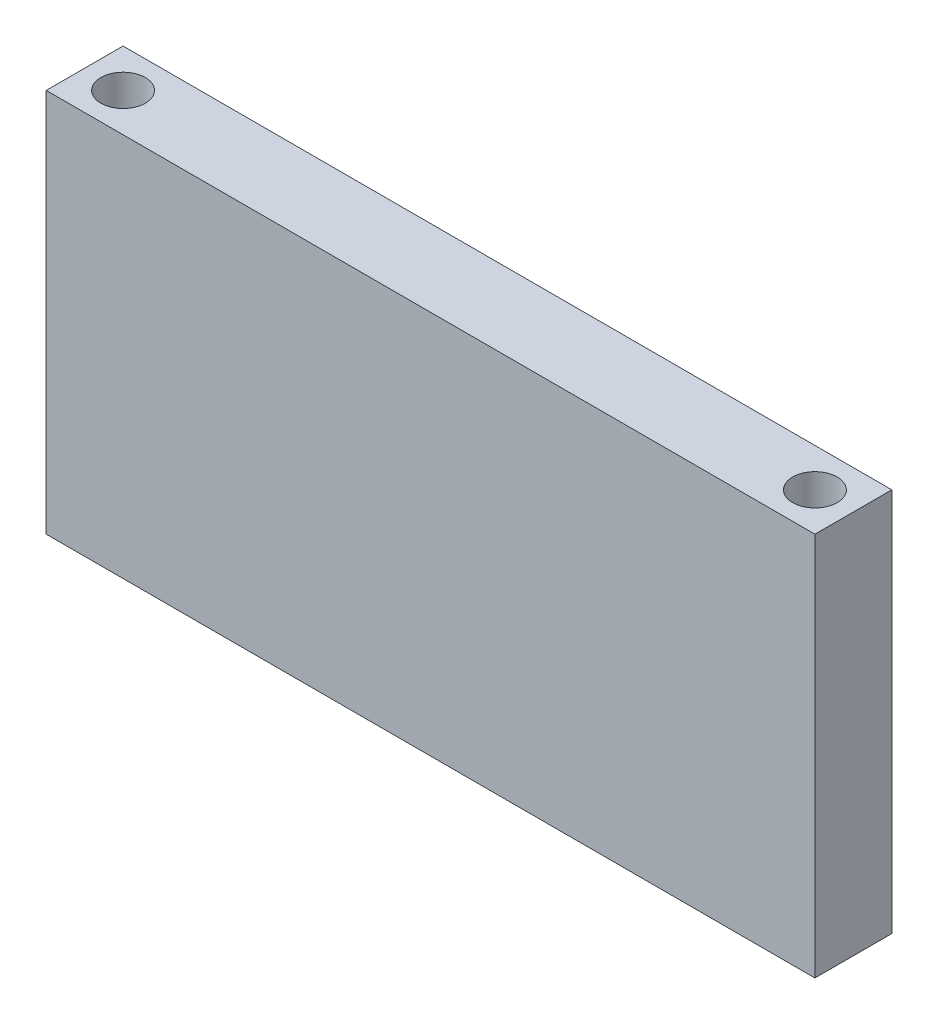
ISO-10303-21;
HEADER;
FILE_DESCRIPTION(('STEP AP214'),'2;1');
FILE_NAME('part.step','',(''),(''),'','','');
FILE_SCHEMA(('AUTOMOTIVE_DESIGN { 1 0 10303 214 1 1 1 1 }'));
ENDSEC;
DATA;
#1=APPLICATION_CONTEXT('core data for automotive mechanical design processes');
#2=APPLICATION_PROTOCOL_DEFINITION('international standard','automotive_design',2000,#1);
#3=PRODUCT_CONTEXT('',#1,'mechanical');
#4=PRODUCT('Part','Part','',(#3));
#5=PRODUCT_RELATED_PRODUCT_CATEGORY('part','',(#4));
#6=PRODUCT_DEFINITION_FORMATION('','',#4);
#7=PRODUCT_DEFINITION_CONTEXT('part definition',#1,'design');
#8=PRODUCT_DEFINITION('design','',#6,#7);
#9=PRODUCT_DEFINITION_SHAPE('','',#8);
#10=(LENGTH_UNIT() NAMED_UNIT(*) SI_UNIT(.MILLI.,.METRE.));
#11=(NAMED_UNIT(*) PLANE_ANGLE_UNIT() SI_UNIT($,.RADIAN.));
#12=(NAMED_UNIT(*) SI_UNIT($,.STERADIAN.) SOLID_ANGLE_UNIT());
#13=UNCERTAINTY_MEASURE_WITH_UNIT(LENGTH_MEASURE(1.E-05),#10,'distance_accuracy_value','');
#14=(GEOMETRIC_REPRESENTATION_CONTEXT(3) GLOBAL_UNCERTAINTY_ASSIGNED_CONTEXT((#13)) GLOBAL_UNIT_ASSIGNED_CONTEXT((#10,
#11,#12)) REPRESENTATION_CONTEXT('',''));
#15=CARTESIAN_POINT('',(0.,0.,0.));
#16=DIRECTION('',(0.,0.,1.));
#17=DIRECTION('',(1.,0.,0.));
#18=AXIS2_PLACEMENT_3D('',#15,#16,#17);
#19=CARTESIAN_POINT('',(-38.7878787878788,50.,-10.7575757575758));
#20=DIRECTION('',(1.,0.,0.));
#21=DIRECTION('',(0.,0.,-1.));
#22=AXIS2_PLACEMENT_3D('',#19,#20,#21);
#23=PLANE('',#22);
#24=DIRECTION('',(0.,0.,1.));
#25=VECTOR('',#24,1.);
#26=CARTESIAN_POINT('',(-38.7878787878788,0.,-10.7575757575758));
#27=LINE('',#26,#25);
#28=CARTESIAN_POINT('',(-38.7878787878788,0.,-10.7575757575758));
#29=VERTEX_POINT('',#28);
#30=CARTESIAN_POINT('',(-38.7878787878788,0.,-0.757575757575752));
#31=VERTEX_POINT('',#30);
#32=EDGE_CURVE('E111',#29,#31,#27,.T.);
#33=ORIENTED_EDGE('',*,*,#32,.T.);
#34=DIRECTION('',(0.,-1.,0.));
#35=VECTOR('',#34,1.);
#36=CARTESIAN_POINT('',(-38.7878787878788,50.,-0.757575757575752));
#37=LINE('',#36,#35);
#38=CARTESIAN_POINT('',(-38.7878787878788,50.,-0.757575757575752));
#39=VERTEX_POINT('',#38);
#40=EDGE_CURVE('E11',#39,#31,#37,.T.);
#41=ORIENTED_EDGE('',*,*,#40,.F.);
#42=DIRECTION('',(0.,0.,1.));
#43=VECTOR('',#42,1.);
#44=CARTESIAN_POINT('',(-38.7878787878788,50.,-10.7575757575758));
#45=LINE('',#44,#43);
#46=CARTESIAN_POINT('',(-38.7878787878788,50.,-10.7575757575758));
#47=VERTEX_POINT('',#46);
#48=EDGE_CURVE('E95',#47,#39,#45,.T.);
#49=ORIENTED_EDGE('',*,*,#48,.F.);
#50=DIRECTION('',(0.,-1.,0.));
#51=VECTOR('',#50,1.);
#52=CARTESIAN_POINT('',(-38.7878787878788,50.,-10.7575757575758));
#53=LINE('',#52,#51);
#54=EDGE_CURVE('E107',#47,#29,#53,.T.);
#55=ORIENTED_EDGE('',*,*,#54,.T.);
#56=EDGE_LOOP('',(#33,#41,#49,#55));
#57=FACE_BOUND('',#56,.T.);
#58=ADVANCED_FACE('F43',(#57),#23,.F.);
#59=CARTESIAN_POINT('',(-38.7878787878788,50.,-0.757575757575752));
#60=DIRECTION('',(0.,0.,-1.));
#61=DIRECTION('',(-1.,0.,0.));
#62=AXIS2_PLACEMENT_3D('',#59,#60,#61);
#63=PLANE('',#62);
#64=DIRECTION('',(1.,0.,0.));
#65=VECTOR('',#64,1.);
#66=CARTESIAN_POINT('',(-38.7878787878788,0.,-0.757575757575752));
#67=LINE('',#66,#65);
#68=CARTESIAN_POINT('',(61.2121212121212,0.,-0.757575757575752));
#69=VERTEX_POINT('',#68);
#70=EDGE_CURVE('E100',#31,#69,#67,.T.);
#71=ORIENTED_EDGE('',*,*,#70,.T.);
#72=DIRECTION('',(0.,-1.,0.));
#73=VECTOR('',#72,1.);
#74=CARTESIAN_POINT('',(61.2121212121212,50.,-0.757575757575752));
#75=LINE('',#74,#73);
#76=CARTESIAN_POINT('',(61.2121212121212,50.,-0.757575757575752));
#77=VERTEX_POINT('',#76);
#78=EDGE_CURVE('E52',#77,#69,#75,.T.);
#79=ORIENTED_EDGE('',*,*,#78,.F.);
#80=DIRECTION('',(1.,0.,0.));
#81=VECTOR('',#80,1.);
#82=CARTESIAN_POINT('',(-38.7878787878788,50.,-0.757575757575752));
#83=LINE('',#82,#81);
#84=EDGE_CURVE('E90',#39,#77,#83,.T.);
#85=ORIENTED_EDGE('',*,*,#84,.F.);
#86=ORIENTED_EDGE('',*,*,#40,.T.);
#87=EDGE_LOOP('',(#71,#79,#85,#86));
#88=FACE_BOUND('',#87,.T.);
#89=ADVANCED_FACE('F99',(#88),#63,.F.);
#90=CARTESIAN_POINT('',(61.2121212121212,50.,-10.7575757575758));
#91=DIRECTION('',(-1.,0.,0.));
#92=DIRECTION('',(0.,0.,1.));
#93=AXIS2_PLACEMENT_3D('',#90,#91,#92);
#94=PLANE('',#93);
#95=DIRECTION('',(0.,0.,-1.));
#96=VECTOR('',#95,1.);
#97=CARTESIAN_POINT('',(61.2121212121212,0.,-10.7575757575758));
#98=LINE('',#97,#96);
#99=CARTESIAN_POINT('',(61.2121212121212,0.,-10.7575757575758));
#100=VERTEX_POINT('',#99);
#101=EDGE_CURVE('E77',#69,#100,#98,.T.);
#102=ORIENTED_EDGE('',*,*,#101,.T.);
#103=DIRECTION('',(0.,-1.,0.));
#104=VECTOR('',#103,1.);
#105=CARTESIAN_POINT('',(61.2121212121212,50.,-10.7575757575758));
#106=LINE('',#105,#104);
#107=CARTESIAN_POINT('',(61.2121212121212,50.,-10.7575757575758));
#108=VERTEX_POINT('',#107);
#109=EDGE_CURVE('E102',#108,#100,#106,.T.);
#110=ORIENTED_EDGE('',*,*,#109,.F.);
#111=DIRECTION('',(0.,0.,-1.));
#112=VECTOR('',#111,1.);
#113=CARTESIAN_POINT('',(61.2121212121212,50.,-10.7575757575758));
#114=LINE('',#113,#112);
#115=EDGE_CURVE('E93',#77,#108,#114,.T.);
#116=ORIENTED_EDGE('',*,*,#115,.F.);
#117=ORIENTED_EDGE('',*,*,#78,.T.);
#118=EDGE_LOOP('',(#102,#110,#116,#117));
#119=FACE_BOUND('',#118,.T.);
#120=ADVANCED_FACE('F103',(#119),#94,.F.);
#121=CARTESIAN_POINT('',(-38.7878787878788,50.,-10.7575757575758));
#122=DIRECTION('',(0.,0.,1.));
#123=DIRECTION('',(1.,0.,0.));
#124=AXIS2_PLACEMENT_3D('',#121,#122,#123);
#125=PLANE('',#124);
#126=DIRECTION('',(-1.,0.,0.));
#127=VECTOR('',#126,1.);
#128=CARTESIAN_POINT('',(-38.7878787878788,0.,-10.7575757575758));
#129=LINE('',#128,#127);
#130=EDGE_CURVE('E83',#100,#29,#129,.T.);
#131=ORIENTED_EDGE('',*,*,#130,.T.);
#132=ORIENTED_EDGE('',*,*,#54,.F.);
#133=DIRECTION('',(-1.,0.,0.));
#134=VECTOR('',#133,1.);
#135=CARTESIAN_POINT('',(-38.7878787878788,50.,-10.7575757575758));
#136=LINE('',#135,#134);
#137=EDGE_CURVE('E60',#108,#47,#136,.T.);
#138=ORIENTED_EDGE('',*,*,#137,.F.);
#139=ORIENTED_EDGE('',*,*,#109,.T.);
#140=EDGE_LOOP('',(#131,#132,#138,#139));
#141=FACE_BOUND('',#140,.T.);
#142=ADVANCED_FACE('F125',(#141),#125,.F.);
#143=CARTESIAN_POINT('',(0.,50.,0.));
#144=DIRECTION('',(0.,1.,0.));
#145=DIRECTION('',(0.,0.,1.));
#146=AXIS2_PLACEMENT_3D('',#143,#144,#145);
#147=PLANE('',#146);
#148=CARTESIAN_POINT('',(56.2121212121212,50.,-5.75757575757575));
#149=DIRECTION('',(0.,-1.,0.));
#150=DIRECTION('',(0.,0.,-1.));
#151=AXIS2_PLACEMENT_3D('',#148,#149,#150);
#152=CIRCLE('',#151,2.89559999999999);
#153=CARTESIAN_POINT('',(56.2121212121212,50.,-8.65317575757574));
#154=VERTEX_POINT('',#153);
#155=EDGE_CURVE('E139',#154,#154,#152,.T.);
#156=ORIENTED_EDGE('',*,*,#155,.T.);
#157=EDGE_LOOP('',(#156));
#158=FACE_BOUND('',#157,.T.);
#159=CARTESIAN_POINT('',(-33.7878787878788,50.,-5.75757575757575));
#160=DIRECTION('',(0.,-1.,0.));
#161=DIRECTION('',(0.,0.,-1.));
#162=AXIS2_PLACEMENT_3D('',#159,#160,#161);
#163=CIRCLE('',#162,2.89559999999999);
#164=CARTESIAN_POINT('',(-33.7878787878788,50.,-8.65317575757574));
#165=VERTEX_POINT('',#164);
#166=EDGE_CURVE('E115',#165,#165,#163,.T.);
#167=ORIENTED_EDGE('',*,*,#166,.T.);
#168=EDGE_LOOP('',(#167));
#169=FACE_BOUND('',#168,.T.);
#170=ORIENTED_EDGE('',*,*,#48,.T.);
#171=ORIENTED_EDGE('',*,*,#84,.T.);
#172=ORIENTED_EDGE('',*,*,#115,.T.);
#173=ORIENTED_EDGE('',*,*,#137,.T.);
#174=EDGE_LOOP('',(#170,#171,#172,#173));
#175=FACE_BOUND('',#174,.T.);
#176=ADVANCED_FACE('F91',(#158,#169,#175),#147,.T.);
#177=CARTESIAN_POINT('',(0.,0.,0.));
#178=DIRECTION('',(0.,1.,0.));
#179=DIRECTION('',(0.,0.,1.));
#180=AXIS2_PLACEMENT_3D('',#177,#178,#179);
#181=PLANE('',#180);
#182=CARTESIAN_POINT('',(56.2121212121212,0.,-5.75757575757575));
#183=DIRECTION('',(0.,-1.,0.));
#184=DIRECTION('',(0.,0.,-1.));
#185=AXIS2_PLACEMENT_3D('',#182,#183,#184);
#186=CIRCLE('',#185,2.8956);
#187=CARTESIAN_POINT('',(56.2121212121212,0.,-8.65317575757575));
#188=VERTEX_POINT('',#187);
#189=EDGE_CURVE('E143',#188,#188,#186,.T.);
#190=ORIENTED_EDGE('',*,*,#189,.F.);
#191=EDGE_LOOP('',(#190));
#192=FACE_BOUND('',#191,.T.);
#193=CARTESIAN_POINT('',(-33.7878787878788,0.,-5.75757575757575));
#194=DIRECTION('',(0.,-1.,0.));
#195=DIRECTION('',(0.,0.,-1.));
#196=AXIS2_PLACEMENT_3D('',#193,#194,#195);
#197=CIRCLE('',#196,2.8956);
#198=CARTESIAN_POINT('',(-33.7878787878788,0.,-8.65317575757575));
#199=VERTEX_POINT('',#198);
#200=EDGE_CURVE('E135',#199,#199,#197,.T.);
#201=ORIENTED_EDGE('',*,*,#200,.F.);
#202=EDGE_LOOP('',(#201));
#203=FACE_BOUND('',#202,.T.);
#204=ORIENTED_EDGE('',*,*,#32,.F.);
#205=ORIENTED_EDGE('',*,*,#130,.F.);
#206=ORIENTED_EDGE('',*,*,#101,.F.);
#207=ORIENTED_EDGE('',*,*,#70,.F.);
#208=EDGE_LOOP('',(#204,#205,#206,#207));
#209=FACE_BOUND('',#208,.T.);
#210=ADVANCED_FACE('F128',(#192,#203,#209),#181,.F.);
#211=CARTESIAN_POINT('',(-33.7878787878788,0.,-5.75757575757575));
#212=DIRECTION('',(0.,-1.,0.));
#213=DIRECTION('',(0.,0.,-1.));
#214=AXIS2_PLACEMENT_3D('',#211,#212,#213);
#215=CYLINDRICAL_SURFACE('',#214,2.89559999999999);
#216=ORIENTED_EDGE('',*,*,#166,.F.);
#217=EDGE_LOOP('',(#216));
#218=FACE_BOUND('',#217,.T.);
#219=ORIENTED_EDGE('',*,*,#200,.T.);
#220=EDGE_LOOP('',(#219));
#221=FACE_BOUND('',#220,.T.);
#222=ADVANCED_FACE('F152',(#218,#221),#215,.F.);
#223=CARTESIAN_POINT('',(56.2121212121212,0.,-5.75757575757575));
#224=DIRECTION('',(0.,-1.,0.));
#225=DIRECTION('',(0.,0.,-1.));
#226=AXIS2_PLACEMENT_3D('',#223,#224,#225);
#227=CYLINDRICAL_SURFACE('',#226,2.89559999999999);
#228=ORIENTED_EDGE('',*,*,#155,.F.);
#229=EDGE_LOOP('',(#228));
#230=FACE_BOUND('',#229,.T.);
#231=ORIENTED_EDGE('',*,*,#189,.T.);
#232=EDGE_LOOP('',(#231));
#233=FACE_BOUND('',#232,.T.);
#234=ADVANCED_FACE('F148',(#230,#233),#227,.F.);
#235=CLOSED_SHELL('',(#58,#89,#120,#142,#176,#210,#222,#234));
#236=MANIFOLD_SOLID_BREP('B2',#235);
#237=ADVANCED_BREP_SHAPE_REPRESENTATION('',(#18,#236),#14);
#238=SHAPE_DEFINITION_REPRESENTATION(#9,#237);
ENDSEC;
END-ISO-10303-21;
